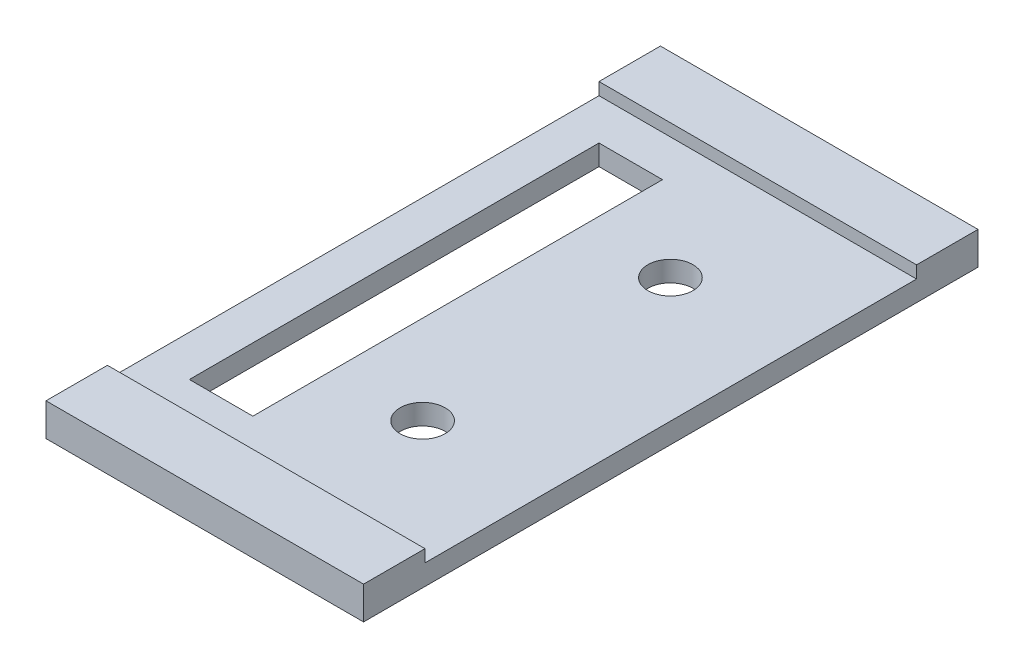
ISO-10303-21;
HEADER;
FILE_DESCRIPTION(('STEP AP214'),'2;1');
FILE_NAME('part.step','',(''),(''),'','','');
FILE_SCHEMA(('AUTOMOTIVE_DESIGN { 1 0 10303 214 1 1 1 1 }'));
ENDSEC;
DATA;
#1=APPLICATION_CONTEXT('core data for automotive mechanical design processes');
#2=APPLICATION_PROTOCOL_DEFINITION('international standard','automotive_design',2000,#1);
#3=PRODUCT_CONTEXT('',#1,'mechanical');
#4=PRODUCT('Part','Part','',(#3));
#5=PRODUCT_RELATED_PRODUCT_CATEGORY('part','',(#4));
#6=PRODUCT_DEFINITION_FORMATION('','',#4);
#7=PRODUCT_DEFINITION_CONTEXT('part definition',#1,'design');
#8=PRODUCT_DEFINITION('design','',#6,#7);
#9=PRODUCT_DEFINITION_SHAPE('','',#8);
#10=(LENGTH_UNIT() NAMED_UNIT(*) SI_UNIT(.MILLI.,.METRE.));
#11=(NAMED_UNIT(*) PLANE_ANGLE_UNIT() SI_UNIT($,.RADIAN.));
#12=(NAMED_UNIT(*) SI_UNIT($,.STERADIAN.) SOLID_ANGLE_UNIT());
#13=UNCERTAINTY_MEASURE_WITH_UNIT(LENGTH_MEASURE(1.E-05),#10,'distance_accuracy_value','');
#14=(GEOMETRIC_REPRESENTATION_CONTEXT(3) GLOBAL_UNCERTAINTY_ASSIGNED_CONTEXT((#13)) GLOBAL_UNIT_ASSIGNED_CONTEXT((#10,
#11,#12)) REPRESENTATION_CONTEXT('',''));
#15=CARTESIAN_POINT('',(0.,0.,0.));
#16=DIRECTION('',(0.,0.,1.));
#17=DIRECTION('',(1.,0.,0.));
#18=AXIS2_PLACEMENT_3D('',#15,#16,#17);
#19=CARTESIAN_POINT('',(39.3827,4.064,0.));
#20=DIRECTION('',(-1.,0.,0.));
#21=DIRECTION('',(0.,0.,1.));
#22=AXIS2_PLACEMENT_3D('',#19,#20,#21);
#23=PLANE('',#22);
#24=DIRECTION('',(0.,0.,-1.));
#25=VECTOR('',#24,1.);
#26=CARTESIAN_POINT('',(39.3827,0.,0.));
#27=LINE('',#26,#25);
#28=CARTESIAN_POINT('',(39.3827,0.,0.));
#29=VERTEX_POINT('',#28);
#30=CARTESIAN_POINT('',(39.3827,0.,-76.2));
#31=VERTEX_POINT('',#30);
#32=EDGE_CURVE('E211',#29,#31,#27,.T.);
#33=ORIENTED_EDGE('',*,*,#32,.T.);
#34=DIRECTION('',(0.,-1.,0.));
#35=VECTOR('',#34,1.);
#36=CARTESIAN_POINT('',(39.3827,4.064,-76.2));
#37=LINE('',#36,#35);
#38=CARTESIAN_POINT('',(39.3827,4.064,-76.2));
#39=VERTEX_POINT('',#38);
#40=EDGE_CURVE('E146',#39,#31,#37,.T.);
#41=ORIENTED_EDGE('',*,*,#40,.F.);
#42=DIRECTION('',(0.,0.,-1.));
#43=VECTOR('',#42,1.);
#44=CARTESIAN_POINT('',(39.3827,4.064,0.));
#45=LINE('',#44,#43);
#46=CARTESIAN_POINT('',(39.3827,4.064,-68.58));
#47=VERTEX_POINT('',#46);
#48=EDGE_CURVE('E149',#47,#39,#45,.T.);
#49=ORIENTED_EDGE('',*,*,#48,.F.);
#50=DIRECTION('',(0.,-1.,0.));
#51=VECTOR('',#50,1.);
#52=CARTESIAN_POINT('',(39.3827,4.064,-68.58));
#53=LINE('',#52,#51);
#54=CARTESIAN_POINT('',(39.3827,2.54,-68.58));
#55=VERTEX_POINT('',#54);
#56=EDGE_CURVE('E137',#47,#55,#53,.T.);
#57=ORIENTED_EDGE('',*,*,#56,.T.);
#58=DIRECTION('',(0.,0.,-1.));
#59=VECTOR('',#58,1.);
#60=CARTESIAN_POINT('',(39.3827,2.54,0.));
#61=LINE('',#60,#59);
#62=CARTESIAN_POINT('',(39.3827,2.54,-7.62));
#63=VERTEX_POINT('',#62);
#64=EDGE_CURVE('E188',#63,#55,#61,.T.);
#65=ORIENTED_EDGE('',*,*,#64,.F.);
#66=DIRECTION('',(0.,-1.,0.));
#67=VECTOR('',#66,1.);
#68=CARTESIAN_POINT('',(39.3827,4.064,-7.62));
#69=LINE('',#68,#67);
#70=CARTESIAN_POINT('',(39.3827,4.064,-7.62));
#71=VERTEX_POINT('',#70);
#72=EDGE_CURVE('E11',#71,#63,#69,.T.);
#73=ORIENTED_EDGE('',*,*,#72,.F.);
#74=DIRECTION('',(0.,0.,-1.));
#75=VECTOR('',#74,1.);
#76=CARTESIAN_POINT('',(39.3827,4.064,0.));
#77=LINE('',#76,#75);
#78=CARTESIAN_POINT('',(39.3827,4.064,0.));
#79=VERTEX_POINT('',#78);
#80=EDGE_CURVE('E208',#79,#71,#77,.T.);
#81=ORIENTED_EDGE('',*,*,#80,.F.);
#82=DIRECTION('',(0.,-1.,0.));
#83=VECTOR('',#82,1.);
#84=CARTESIAN_POINT('',(39.3827,4.064,0.));
#85=LINE('',#84,#83);
#86=EDGE_CURVE('E205',#79,#29,#85,.T.);
#87=ORIENTED_EDGE('',*,*,#86,.T.);
#88=EDGE_LOOP('',(#33,#41,#49,#57,#65,#73,#81,#87));
#89=FACE_BOUND('',#88,.T.);
#90=ADVANCED_FACE('F35',(#89),#23,.F.);
#91=CARTESIAN_POINT('',(0.,4.064,-7.62));
#92=DIRECTION('',(0.,0.,1.));
#93=DIRECTION('',(1.,0.,0.));
#94=AXIS2_PLACEMENT_3D('',#91,#92,#93);
#95=PLANE('',#94);
#96=ORIENTED_EDGE('',*,*,#72,.T.);
#97=DIRECTION('',(-1.,0.,0.));
#98=VECTOR('',#97,1.);
#99=CARTESIAN_POINT('',(0.,2.54,-7.62));
#100=LINE('',#99,#98);
#101=CARTESIAN_POINT('',(0.,2.54,-7.62));
#102=VERTEX_POINT('',#101);
#103=EDGE_CURVE('E181',#63,#102,#100,.T.);
#104=ORIENTED_EDGE('',*,*,#103,.T.);
#105=DIRECTION('',(0.,-1.,0.));
#106=VECTOR('',#105,1.);
#107=CARTESIAN_POINT('',(0.,4.064,-7.62));
#108=LINE('',#107,#106);
#109=CARTESIAN_POINT('',(0.,4.064,-7.62));
#110=VERTEX_POINT('',#109);
#111=EDGE_CURVE('E44',#110,#102,#108,.T.);
#112=ORIENTED_EDGE('',*,*,#111,.F.);
#113=DIRECTION('',(-1.,0.,0.));
#114=VECTOR('',#113,1.);
#115=CARTESIAN_POINT('',(0.,4.064,-7.62));
#116=LINE('',#115,#114);
#117=EDGE_CURVE('E83',#71,#110,#116,.T.);
#118=ORIENTED_EDGE('',*,*,#117,.F.);
#119=EDGE_LOOP('',(#96,#104,#112,#118));
#120=FACE_BOUND('',#119,.T.);
#121=ADVANCED_FACE('F285',(#120),#95,.F.);
#122=CARTESIAN_POINT('',(0.,4.064,0.));
#123=DIRECTION('',(-1.,0.,0.));
#124=DIRECTION('',(0.,0.,1.));
#125=AXIS2_PLACEMENT_3D('',#122,#123,#124);
#126=PLANE('',#125);
#127=DIRECTION('',(0.,0.,-1.));
#128=VECTOR('',#127,1.);
#129=CARTESIAN_POINT('',(0.,0.,0.));
#130=LINE('',#129,#128);
#131=CARTESIAN_POINT('',(0.,0.,0.));
#132=VERTEX_POINT('',#131);
#133=CARTESIAN_POINT('',(0.,0.,-76.2));
#134=VERTEX_POINT('',#133);
#135=EDGE_CURVE('E209',#132,#134,#130,.T.);
#136=ORIENTED_EDGE('',*,*,#135,.F.);
#137=DIRECTION('',(0.,-1.,0.));
#138=VECTOR('',#137,1.);
#139=CARTESIAN_POINT('',(0.,4.064,0.));
#140=LINE('',#139,#138);
#141=CARTESIAN_POINT('',(0.,4.064,0.));
#142=VERTEX_POINT('',#141);
#143=EDGE_CURVE('E203',#142,#132,#140,.T.);
#144=ORIENTED_EDGE('',*,*,#143,.F.);
#145=DIRECTION('',(0.,0.,-1.));
#146=VECTOR('',#145,1.);
#147=CARTESIAN_POINT('',(0.,4.064,0.));
#148=LINE('',#147,#146);
#149=EDGE_CURVE('E215',#142,#110,#148,.T.);
#150=ORIENTED_EDGE('',*,*,#149,.T.);
#151=ORIENTED_EDGE('',*,*,#111,.T.);
#152=DIRECTION('',(0.,0.,-1.));
#153=VECTOR('',#152,1.);
#154=CARTESIAN_POINT('',(0.,2.54,0.));
#155=LINE('',#154,#153);
#156=CARTESIAN_POINT('',(0.,2.54,-68.58));
#157=VERTEX_POINT('',#156);
#158=EDGE_CURVE('E52',#102,#157,#155,.T.);
#159=ORIENTED_EDGE('',*,*,#158,.T.);
#160=DIRECTION('',(0.,-1.,0.));
#161=VECTOR('',#160,1.);
#162=CARTESIAN_POINT('',(0.,4.064,-68.58));
#163=LINE('',#162,#161);
#164=CARTESIAN_POINT('',(0.,4.064,-68.58));
#165=VERTEX_POINT('',#164);
#166=EDGE_CURVE('E165',#165,#157,#163,.T.);
#167=ORIENTED_EDGE('',*,*,#166,.F.);
#168=DIRECTION('',(0.,0.,-1.));
#169=VECTOR('',#168,1.);
#170=CARTESIAN_POINT('',(0.,4.064,0.));
#171=LINE('',#170,#169);
#172=CARTESIAN_POINT('',(0.,4.064,-76.2));
#173=VERTEX_POINT('',#172);
#174=EDGE_CURVE('E158',#165,#173,#171,.T.);
#175=ORIENTED_EDGE('',*,*,#174,.T.);
#176=DIRECTION('',(0.,-1.,0.));
#177=VECTOR('',#176,1.);
#178=CARTESIAN_POINT('',(0.,4.064,-76.2));
#179=LINE('',#178,#177);
#180=EDGE_CURVE('E169',#173,#134,#179,.T.);
#181=ORIENTED_EDGE('',*,*,#180,.T.);
#182=EDGE_LOOP('',(#136,#144,#150,#151,#159,#167,#175,#181));
#183=FACE_BOUND('',#182,.T.);
#184=ADVANCED_FACE('F289',(#183),#126,.T.);
#185=CARTESIAN_POINT('',(0.,4.064,0.));
#186=DIRECTION('',(0.,0.,-1.));
#187=DIRECTION('',(-1.,0.,0.));
#188=AXIS2_PLACEMENT_3D('',#185,#186,#187);
#189=PLANE('',#188);
#190=DIRECTION('',(1.,0.,0.));
#191=VECTOR('',#190,1.);
#192=CARTESIAN_POINT('',(0.,0.,0.));
#193=LINE('',#192,#191);
#194=EDGE_CURVE('E76',#132,#29,#193,.T.);
#195=ORIENTED_EDGE('',*,*,#194,.T.);
#196=ORIENTED_EDGE('',*,*,#86,.F.);
#197=DIRECTION('',(1.,0.,0.));
#198=VECTOR('',#197,1.);
#199=CARTESIAN_POINT('',(0.,4.064,0.));
#200=LINE('',#199,#198);
#201=EDGE_CURVE('E61',#142,#79,#200,.T.);
#202=ORIENTED_EDGE('',*,*,#201,.F.);
#203=ORIENTED_EDGE('',*,*,#143,.T.);
#204=EDGE_LOOP('',(#195,#196,#202,#203));
#205=FACE_BOUND('',#204,.T.);
#206=ADVANCED_FACE('F279',(#205),#189,.F.);
#207=CARTESIAN_POINT('',(0.,4.064,0.));
#208=DIRECTION('',(0.,1.,0.));
#209=DIRECTION('',(0.,0.,1.));
#210=AXIS2_PLACEMENT_3D('',#207,#208,#209);
#211=PLANE('',#210);
#212=ORIENTED_EDGE('',*,*,#80,.T.);
#213=ORIENTED_EDGE('',*,*,#117,.T.);
#214=ORIENTED_EDGE('',*,*,#149,.F.);
#215=ORIENTED_EDGE('',*,*,#201,.T.);
#216=EDGE_LOOP('',(#212,#213,#214,#215));
#217=FACE_BOUND('',#216,.T.);
#218=ADVANCED_FACE('F271',(#217),#211,.T.);
#219=CARTESIAN_POINT('',(0.,0.,0.));
#220=DIRECTION('',(0.,1.,0.));
#221=DIRECTION('',(0.,0.,1.));
#222=AXIS2_PLACEMENT_3D('',#219,#220,#221);
#223=PLANE('',#222);
#224=ORIENTED_EDGE('',*,*,#32,.F.);
#225=ORIENTED_EDGE('',*,*,#194,.F.);
#226=ORIENTED_EDGE('',*,*,#135,.T.);
#227=DIRECTION('',(1.,0.,0.));
#228=VECTOR('',#227,1.);
#229=CARTESIAN_POINT('',(0.,0.,-76.2));
#230=LINE('',#229,#228);
#231=EDGE_CURVE('E159',#134,#31,#230,.T.);
#232=ORIENTED_EDGE('',*,*,#231,.T.);
#233=EDGE_LOOP('',(#224,#225,#226,#232));
#234=FACE_BOUND('',#233,.T.);
#235=CARTESIAN_POINT('',(23.9719322618683,0.,-22.733));
#236=DIRECTION('',(0.,1.,0.));
#237=DIRECTION('',(0.,0.,1.));
#238=AXIS2_PLACEMENT_3D('',#235,#236,#237);
#239=CIRCLE('',#238,2.79399999999999);
#240=CARTESIAN_POINT('',(23.9719322618683,0.,-19.939));
#241=VERTEX_POINT('',#240);
#242=EDGE_CURVE('E145',#241,#241,#239,.T.);
#243=ORIENTED_EDGE('',*,*,#242,.T.);
#244=EDGE_LOOP('',(#243));
#245=FACE_BOUND('',#244,.T.);
#246=CARTESIAN_POINT('',(23.9719322618683,0.,-53.467));
#247=DIRECTION('',(0.,1.,0.));
#248=DIRECTION('',(0.,0.,1.));
#249=AXIS2_PLACEMENT_3D('',#246,#247,#248);
#250=CIRCLE('',#249,2.79399999999999);
#251=CARTESIAN_POINT('',(23.9719322618683,0.,-50.673));
#252=VERTEX_POINT('',#251);
#253=EDGE_CURVE('E239',#252,#252,#250,.T.);
#254=ORIENTED_EDGE('',*,*,#253,.T.);
#255=EDGE_LOOP('',(#254));
#256=FACE_BOUND('',#255,.T.);
#257=DIRECTION('',(0.,0.,-1.));
#258=VECTOR('',#257,1.);
#259=CARTESIAN_POINT('',(12.954,0.,0.));
#260=LINE('',#259,#258);
#261=CARTESIAN_POINT('',(12.954,0.,-12.7));
#262=VERTEX_POINT('',#261);
#263=CARTESIAN_POINT('',(12.954,0.,-63.5));
#264=VERTEX_POINT('',#263);
#265=EDGE_CURVE('E236',#262,#264,#260,.T.);
#266=ORIENTED_EDGE('',*,*,#265,.T.);
#267=DIRECTION('',(-1.,0.,0.));
#268=VECTOR('',#267,1.);
#269=CARTESIAN_POINT('',(0.,0.,-63.5));
#270=LINE('',#269,#268);
#271=CARTESIAN_POINT('',(5.08,0.,-63.5));
#272=VERTEX_POINT('',#271);
#273=EDGE_CURVE('E178',#264,#272,#270,.T.);
#274=ORIENTED_EDGE('',*,*,#273,.T.);
#275=DIRECTION('',(0.,0.,1.));
#276=VECTOR('',#275,1.);
#277=CARTESIAN_POINT('',(5.08000000000001,0.,0.));
#278=LINE('',#277,#276);
#279=CARTESIAN_POINT('',(5.08000000000001,0.,-12.7));
#280=VERTEX_POINT('',#279);
#281=EDGE_CURVE('E230',#272,#280,#278,.T.);
#282=ORIENTED_EDGE('',*,*,#281,.T.);
#283=DIRECTION('',(1.,0.,0.));
#284=VECTOR('',#283,1.);
#285=CARTESIAN_POINT('',(0.,0.,-12.7));
#286=LINE('',#285,#284);
#287=EDGE_CURVE('E233',#280,#262,#286,.T.);
#288=ORIENTED_EDGE('',*,*,#287,.T.);
#289=EDGE_LOOP('',(#266,#274,#282,#288));
#290=FACE_BOUND('',#289,.T.);
#291=ADVANCED_FACE('F269',(#234,#245,#256,#290),#223,.F.);
#292=CARTESIAN_POINT('',(12.954,2.54,0.));
#293=DIRECTION('',(-1.,0.,0.));
#294=DIRECTION('',(0.,0.,1.));
#295=AXIS2_PLACEMENT_3D('',#292,#293,#294);
#296=PLANE('',#295);
#297=ORIENTED_EDGE('',*,*,#265,.F.);
#298=DIRECTION('',(0.,-1.,0.));
#299=VECTOR('',#298,1.);
#300=CARTESIAN_POINT('',(12.954,2.54,-12.7));
#301=LINE('',#300,#299);
#302=CARTESIAN_POINT('',(12.954,2.54,-12.7));
#303=VERTEX_POINT('',#302);
#304=EDGE_CURVE('E213',#303,#262,#301,.T.);
#305=ORIENTED_EDGE('',*,*,#304,.F.);
#306=DIRECTION('',(0.,0.,-1.));
#307=VECTOR('',#306,1.);
#308=CARTESIAN_POINT('',(12.954,2.54,0.));
#309=LINE('',#308,#307);
#310=CARTESIAN_POINT('',(12.954,2.54,-63.5));
#311=VERTEX_POINT('',#310);
#312=EDGE_CURVE('E192',#303,#311,#309,.T.);
#313=ORIENTED_EDGE('',*,*,#312,.T.);
#314=DIRECTION('',(0.,-1.,0.));
#315=VECTOR('',#314,1.);
#316=CARTESIAN_POINT('',(12.954,2.54,-63.5));
#317=LINE('',#316,#315);
#318=EDGE_CURVE('E225',#311,#264,#317,.T.);
#319=ORIENTED_EDGE('',*,*,#318,.T.);
#320=EDGE_LOOP('',(#297,#305,#313,#319));
#321=FACE_BOUND('',#320,.T.);
#322=ADVANCED_FACE('F267',(#321),#296,.T.);
#323=CARTESIAN_POINT('',(0.,2.54,-12.7));
#324=DIRECTION('',(0.,0.,-1.));
#325=DIRECTION('',(-1.,0.,0.));
#326=AXIS2_PLACEMENT_3D('',#323,#324,#325);
#327=PLANE('',#326);
#328=ORIENTED_EDGE('',*,*,#287,.F.);
#329=DIRECTION('',(0.,-1.,0.));
#330=VECTOR('',#329,1.);
#331=CARTESIAN_POINT('',(5.08000000000001,2.54,-12.7));
#332=LINE('',#331,#330);
#333=CARTESIAN_POINT('',(5.08000000000001,2.54,-12.7));
#334=VERTEX_POINT('',#333);
#335=EDGE_CURVE('E221',#334,#280,#332,.T.);
#336=ORIENTED_EDGE('',*,*,#335,.F.);
#337=DIRECTION('',(1.,0.,0.));
#338=VECTOR('',#337,1.);
#339=CARTESIAN_POINT('',(0.,2.54,-12.7));
#340=LINE('',#339,#338);
#341=EDGE_CURVE('E196',#334,#303,#340,.T.);
#342=ORIENTED_EDGE('',*,*,#341,.T.);
#343=ORIENTED_EDGE('',*,*,#304,.T.);
#344=EDGE_LOOP('',(#328,#336,#342,#343));
#345=FACE_BOUND('',#344,.T.);
#346=ADVANCED_FACE('F253',(#345),#327,.T.);
#347=CARTESIAN_POINT('',(5.08000000000001,2.54,0.));
#348=DIRECTION('',(1.,0.,0.));
#349=DIRECTION('',(0.,0.,-1.));
#350=AXIS2_PLACEMENT_3D('',#347,#348,#349);
#351=PLANE('',#350);
#352=ORIENTED_EDGE('',*,*,#281,.F.);
#353=DIRECTION('',(0.,-1.,0.));
#354=VECTOR('',#353,1.);
#355=CARTESIAN_POINT('',(5.08,2.54,-63.5));
#356=LINE('',#355,#354);
#357=CARTESIAN_POINT('',(5.08,2.54,-63.5));
#358=VERTEX_POINT('',#357);
#359=EDGE_CURVE('E223',#358,#272,#356,.T.);
#360=ORIENTED_EDGE('',*,*,#359,.F.);
#361=DIRECTION('',(0.,0.,1.));
#362=VECTOR('',#361,1.);
#363=CARTESIAN_POINT('',(5.08000000000001,2.54,0.));
#364=LINE('',#363,#362);
#365=EDGE_CURVE('E246',#358,#334,#364,.T.);
#366=ORIENTED_EDGE('',*,*,#365,.T.);
#367=ORIENTED_EDGE('',*,*,#335,.T.);
#368=EDGE_LOOP('',(#352,#360,#366,#367));
#369=FACE_BOUND('',#368,.T.);
#370=ADVANCED_FACE('F262',(#369),#351,.T.);
#371=CARTESIAN_POINT('',(23.9719322618683,2.54,-53.467));
#372=DIRECTION('',(0.,-1.,0.));
#373=DIRECTION('',(0.,0.,-1.));
#374=AXIS2_PLACEMENT_3D('',#371,#372,#373);
#375=CYLINDRICAL_SURFACE('',#374,2.79399999999999);
#376=CARTESIAN_POINT('',(23.9719322618683,2.54,-53.467));
#377=DIRECTION('',(0.,1.,0.));
#378=DIRECTION('',(0.,0.,1.));
#379=AXIS2_PLACEMENT_3D('',#376,#377,#378);
#380=CIRCLE('',#379,2.79399999999999);
#381=CARTESIAN_POINT('',(23.9719322618683,2.54,-50.673));
#382=VERTEX_POINT('',#381);
#383=EDGE_CURVE('E177',#382,#382,#380,.T.);
#384=ORIENTED_EDGE('',*,*,#383,.T.);
#385=EDGE_LOOP('',(#384));
#386=FACE_BOUND('',#385,.T.);
#387=ORIENTED_EDGE('',*,*,#253,.F.);
#388=EDGE_LOOP('',(#387));
#389=FACE_BOUND('',#388,.T.);
#390=ADVANCED_FACE('F349',(#386,#389),#375,.F.);
#391=CARTESIAN_POINT('',(23.9719322618683,2.54,-22.733));
#392=DIRECTION('',(0.,-1.,0.));
#393=DIRECTION('',(0.,0.,-1.));
#394=AXIS2_PLACEMENT_3D('',#391,#392,#393);
#395=CYLINDRICAL_SURFACE('',#394,2.79399999999999);
#396=CARTESIAN_POINT('',(23.9719322618683,2.54,-22.733));
#397=DIRECTION('',(0.,1.,0.));
#398=DIRECTION('',(0.,0.,1.));
#399=AXIS2_PLACEMENT_3D('',#396,#397,#398);
#400=CIRCLE('',#399,2.79399999999999);
#401=CARTESIAN_POINT('',(23.9719322618683,2.54,-19.939));
#402=VERTEX_POINT('',#401);
#403=EDGE_CURVE('E174',#402,#402,#400,.T.);
#404=ORIENTED_EDGE('',*,*,#403,.T.);
#405=EDGE_LOOP('',(#404));
#406=FACE_BOUND('',#405,.T.);
#407=ORIENTED_EDGE('',*,*,#242,.F.);
#408=EDGE_LOOP('',(#407));
#409=FACE_BOUND('',#408,.T.);
#410=ADVANCED_FACE('F358',(#406,#409),#395,.F.);
#411=CARTESIAN_POINT('',(0.,2.54,-63.5));
#412=DIRECTION('',(0.,0.,1.));
#413=DIRECTION('',(1.,0.,0.));
#414=AXIS2_PLACEMENT_3D('',#411,#412,#413);
#415=PLANE('',#414);
#416=ORIENTED_EDGE('',*,*,#273,.F.);
#417=ORIENTED_EDGE('',*,*,#318,.F.);
#418=DIRECTION('',(-1.,0.,0.));
#419=VECTOR('',#418,1.);
#420=CARTESIAN_POINT('',(0.,2.54,-63.5));
#421=LINE('',#420,#419);
#422=EDGE_CURVE('E227',#311,#358,#421,.T.);
#423=ORIENTED_EDGE('',*,*,#422,.T.);
#424=ORIENTED_EDGE('',*,*,#359,.T.);
#425=EDGE_LOOP('',(#416,#417,#423,#424));
#426=FACE_BOUND('',#425,.T.);
#427=ADVANCED_FACE('F265',(#426),#415,.T.);
#428=CARTESIAN_POINT('',(0.,2.54,0.));
#429=DIRECTION('',(0.,1.,0.));
#430=DIRECTION('',(0.,0.,1.));
#431=AXIS2_PLACEMENT_3D('',#428,#429,#430);
#432=PLANE('',#431);
#433=ORIENTED_EDGE('',*,*,#403,.F.);
#434=EDGE_LOOP('',(#433));
#435=FACE_BOUND('',#434,.T.);
#436=ORIENTED_EDGE('',*,*,#383,.F.);
#437=EDGE_LOOP('',(#436));
#438=FACE_BOUND('',#437,.T.);
#439=ORIENTED_EDGE('',*,*,#103,.F.);
#440=ORIENTED_EDGE('',*,*,#64,.T.);
#441=DIRECTION('',(-1.,0.,0.));
#442=VECTOR('',#441,1.);
#443=CARTESIAN_POINT('',(0.,2.54,-68.58));
#444=LINE('',#443,#442);
#445=EDGE_CURVE('E38',#55,#157,#444,.T.);
#446=ORIENTED_EDGE('',*,*,#445,.T.);
#447=ORIENTED_EDGE('',*,*,#158,.F.);
#448=EDGE_LOOP('',(#439,#440,#446,#447));
#449=FACE_BOUND('',#448,.T.);
#450=ORIENTED_EDGE('',*,*,#312,.F.);
#451=ORIENTED_EDGE('',*,*,#341,.F.);
#452=ORIENTED_EDGE('',*,*,#365,.F.);
#453=ORIENTED_EDGE('',*,*,#422,.F.);
#454=EDGE_LOOP('',(#450,#451,#452,#453));
#455=FACE_BOUND('',#454,.T.);
#456=ADVANCED_FACE('F258',(#435,#438,#449,#455),#432,.T.);
#457=CARTESIAN_POINT('',(0.,4.064,-68.58));
#458=DIRECTION('',(0.,0.,1.));
#459=DIRECTION('',(1.,0.,0.));
#460=AXIS2_PLACEMENT_3D('',#457,#458,#459);
#461=PLANE('',#460);
#462=ORIENTED_EDGE('',*,*,#445,.F.);
#463=ORIENTED_EDGE('',*,*,#56,.F.);
#464=DIRECTION('',(-1.,0.,0.));
#465=VECTOR('',#464,1.);
#466=CARTESIAN_POINT('',(0.,4.064,-68.58));
#467=LINE('',#466,#465);
#468=EDGE_CURVE('E141',#47,#165,#467,.T.);
#469=ORIENTED_EDGE('',*,*,#468,.T.);
#470=ORIENTED_EDGE('',*,*,#166,.T.);
#471=EDGE_LOOP('',(#462,#463,#469,#470));
#472=FACE_BOUND('',#471,.T.);
#473=ADVANCED_FACE('F139',(#472),#461,.T.);
#474=CARTESIAN_POINT('',(0.,4.064,-76.2));
#475=DIRECTION('',(0.,0.,-1.));
#476=DIRECTION('',(-1.,0.,0.));
#477=AXIS2_PLACEMENT_3D('',#474,#475,#476);
#478=PLANE('',#477);
#479=ORIENTED_EDGE('',*,*,#231,.F.);
#480=ORIENTED_EDGE('',*,*,#180,.F.);
#481=DIRECTION('',(1.,0.,0.));
#482=VECTOR('',#481,1.);
#483=CARTESIAN_POINT('',(0.,4.064,-76.2));
#484=LINE('',#483,#482);
#485=EDGE_CURVE('E154',#173,#39,#484,.T.);
#486=ORIENTED_EDGE('',*,*,#485,.T.);
#487=ORIENTED_EDGE('',*,*,#40,.T.);
#488=EDGE_LOOP('',(#479,#480,#486,#487));
#489=FACE_BOUND('',#488,.T.);
#490=ADVANCED_FACE('F394',(#489),#478,.T.);
#491=CARTESIAN_POINT('',(0.,4.064,0.));
#492=DIRECTION('',(0.,1.,0.));
#493=DIRECTION('',(0.,0.,1.));
#494=AXIS2_PLACEMENT_3D('',#491,#492,#493);
#495=PLANE('',#494);
#496=ORIENTED_EDGE('',*,*,#468,.F.);
#497=ORIENTED_EDGE('',*,*,#48,.T.);
#498=ORIENTED_EDGE('',*,*,#485,.F.);
#499=ORIENTED_EDGE('',*,*,#174,.F.);
#500=EDGE_LOOP('',(#496,#497,#498,#499));
#501=FACE_BOUND('',#500,.T.);
#502=ADVANCED_FACE('F156',(#501),#495,.T.);
#503=CLOSED_SHELL('',(#90,#121,#184,#206,#218,#291,#322,#346,#370,#390,#410,#427,#456,#473,#490,#502));
#504=MANIFOLD_SOLID_BREP('B2',#503);
#505=ADVANCED_BREP_SHAPE_REPRESENTATION('',(#18,#504),#14);
#506=SHAPE_DEFINITION_REPRESENTATION(#9,#505);
ENDSEC;
END-ISO-10303-21;
